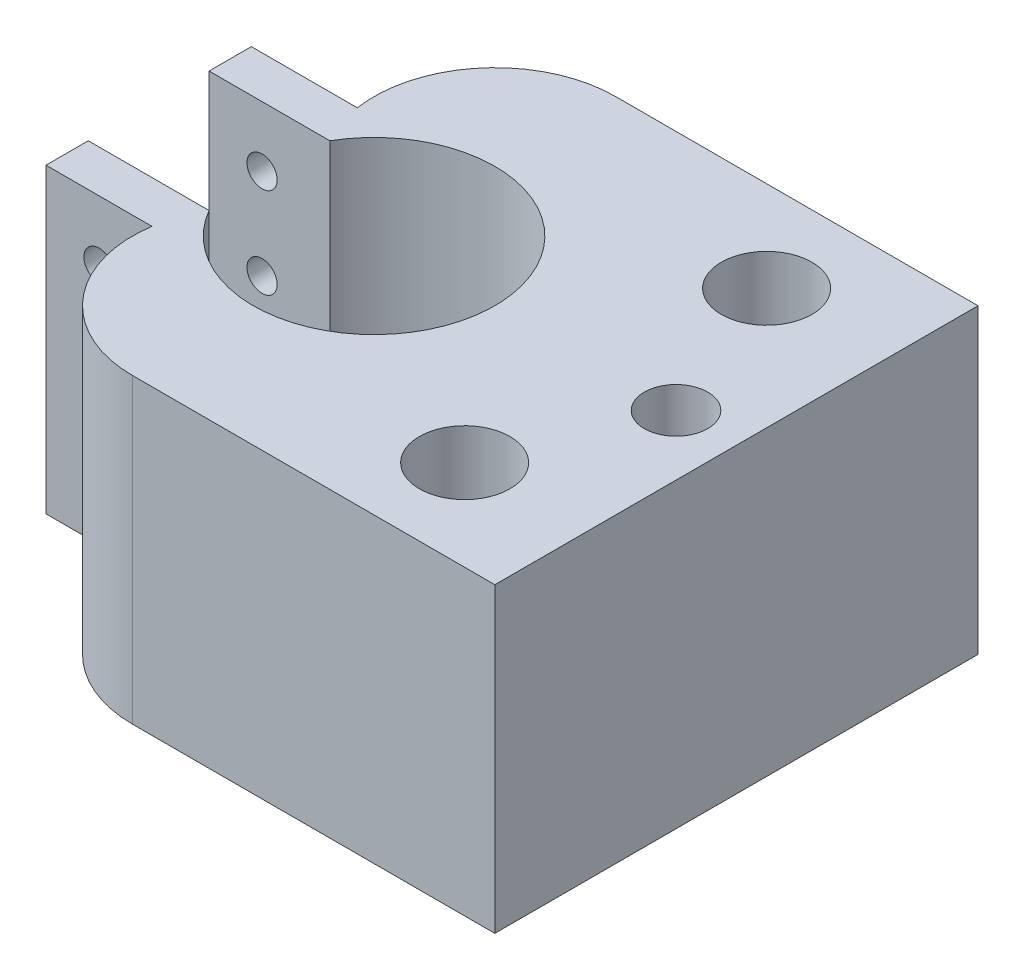
ISO-10303-21;
HEADER;
FILE_DESCRIPTION(('STEP AP214'),'2;1');
FILE_NAME('part.step','',(''),(''),'','','');
FILE_SCHEMA(('AUTOMOTIVE_DESIGN { 1 0 10303 214 1 1 1 1 }'));
ENDSEC;
DATA;
#1=APPLICATION_CONTEXT('core data for automotive mechanical design processes');
#2=APPLICATION_PROTOCOL_DEFINITION('international standard','automotive_design',2000,#1);
#3=PRODUCT_CONTEXT('',#1,'mechanical');
#4=PRODUCT('Part','Part','',(#3));
#5=PRODUCT_RELATED_PRODUCT_CATEGORY('part','',(#4));
#6=PRODUCT_DEFINITION_FORMATION('','',#4);
#7=PRODUCT_DEFINITION_CONTEXT('part definition',#1,'design');
#8=PRODUCT_DEFINITION('design','',#6,#7);
#9=PRODUCT_DEFINITION_SHAPE('','',#8);
#10=(LENGTH_UNIT() NAMED_UNIT(*) SI_UNIT(.MILLI.,.METRE.));
#11=(NAMED_UNIT(*) PLANE_ANGLE_UNIT() SI_UNIT($,.RADIAN.));
#12=(NAMED_UNIT(*) SI_UNIT($,.STERADIAN.) SOLID_ANGLE_UNIT());
#13=UNCERTAINTY_MEASURE_WITH_UNIT(LENGTH_MEASURE(1.E-05),#10,'distance_accuracy_value','');
#14=(GEOMETRIC_REPRESENTATION_CONTEXT(3) GLOBAL_UNCERTAINTY_ASSIGNED_CONTEXT((#13)) GLOBAL_UNIT_ASSIGNED_CONTEXT((#10,
#11,#12)) REPRESENTATION_CONTEXT('',''));
#15=CARTESIAN_POINT('',(0.,0.,0.));
#16=DIRECTION('',(0.,0.,1.));
#17=DIRECTION('',(1.,0.,0.));
#18=AXIS2_PLACEMENT_3D('',#15,#16,#17);
#19=CARTESIAN_POINT('',(-20.,50.,19.1770717334674));
#20=DIRECTION('',(0.,1.,0.));
#21=DIRECTION('',(0.,0.,1.));
#22=AXIS2_PLACEMENT_3D('',#19,#20,#21);
#23=PLANE('',#22);
#24=CARTESIAN_POINT('',(19.9999999999999,50.,24.1770717334674));
#25=DIRECTION('',(0.,1.,0.));
#26=DIRECTION('',(0.,0.,-1.));
#27=AXIS2_PLACEMENT_3D('',#24,#25,#26);
#28=CIRCLE('',#27,7.5);
#29=CARTESIAN_POINT('',(19.9999999999999,50.,16.6770717334674));
#30=VERTEX_POINT('',#29);
#31=EDGE_CURVE('E326',#30,#30,#28,.T.);
#32=ORIENTED_EDGE('',*,*,#31,.F.);
#33=EDGE_LOOP('',(#32));
#34=FACE_BOUND('',#33,.T.);
#35=DIRECTION('',(0.,0.,-1.));
#36=VECTOR('',#35,1.);
#37=CARTESIAN_POINT('',(40.,50.,-40.8229282665326));
#38=LINE('',#37,#36);
#39=CARTESIAN_POINT('',(40.,50.,39.1770717334675));
#40=VERTEX_POINT('',#39);
#41=CARTESIAN_POINT('',(40.,50.,-40.8229282665326));
#42=VERTEX_POINT('',#41);
#43=EDGE_CURVE('E178',#40,#42,#38,.T.);
#44=ORIENTED_EDGE('',*,*,#43,.T.);
#45=DIRECTION('',(-1.,0.,0.));
#46=VECTOR('',#45,1.);
#47=CARTESIAN_POINT('',(-20.,50.,-40.8229282665326));
#48=LINE('',#47,#46);
#49=CARTESIAN_POINT('',(-20.,50.,-40.8229282665326));
#50=VERTEX_POINT('',#49);
#51=EDGE_CURVE('E106',#42,#50,#48,.T.);
#52=ORIENTED_EDGE('',*,*,#51,.T.);
#53=CARTESIAN_POINT('',(-20.,50.,-20.8229282665326));
#54=DIRECTION('',(0.,1.,0.));
#55=DIRECTION('',(0.,0.,1.));
#56=AXIS2_PLACEMENT_3D('',#53,#54,#55);
#57=CIRCLE('',#56,20.);
#58=CARTESIAN_POINT('',(-39.7737199332852,50.,-17.8229282665326));
#59=VERTEX_POINT('',#58);
#60=EDGE_CURVE('E205',#50,#59,#57,.T.);
#61=ORIENTED_EDGE('',*,*,#60,.T.);
#62=DIRECTION('',(-1.,0.,0.));
#63=VECTOR('',#62,1.);
#64=CARTESIAN_POINT('',(-57.3205080756888,50.,-17.8229282665326));
#65=LINE('',#64,#63);
#66=CARTESIAN_POINT('',(-57.3205080756888,50.,-17.8229282665326));
#67=VERTEX_POINT('',#66);
#68=EDGE_CURVE('E224',#59,#67,#65,.T.);
#69=ORIENTED_EDGE('',*,*,#68,.T.);
#70=DIRECTION('',(0.,0.,1.));
#71=VECTOR('',#70,1.);
#72=CARTESIAN_POINT('',(-57.3205080756888,50.,-17.8229282665326));
#73=LINE('',#72,#71);
#74=CARTESIAN_POINT('',(-57.3205080756888,50.,-10.8229282665326));
#75=VERTEX_POINT('',#74);
#76=EDGE_CURVE('E221',#67,#75,#73,.T.);
#77=ORIENTED_EDGE('',*,*,#76,.T.);
#78=DIRECTION('',(1.,0.,0.));
#79=VECTOR('',#78,1.);
#80=CARTESIAN_POINT('',(-57.3205080756888,50.,-10.8229282665326));
#81=LINE('',#80,#79);
#82=CARTESIAN_POINT('',(-37.3205080756888,50.,-10.8229282665326));
#83=VERTEX_POINT('',#82);
#84=EDGE_CURVE('E223',#75,#83,#81,.T.);
#85=ORIENTED_EDGE('',*,*,#84,.T.);
#86=CARTESIAN_POINT('',(-20.,50.,-0.822928266532567));
#87=DIRECTION('',(0.,-1.,0.));
#88=DIRECTION('',(0.,0.,1.));
#89=AXIS2_PLACEMENT_3D('',#86,#87,#88);
#90=CIRCLE('',#89,20.);
#91=CARTESIAN_POINT('',(-37.3205080756888,50.,9.17707173346743));
#92=VERTEX_POINT('',#91);
#93=EDGE_CURVE('E226',#83,#92,#90,.T.);
#94=ORIENTED_EDGE('',*,*,#93,.T.);
#95=DIRECTION('',(-1.,0.,0.));
#96=VECTOR('',#95,1.);
#97=CARTESIAN_POINT('',(-57.3205080756888,50.,9.17707173346739));
#98=LINE('',#97,#96);
#99=CARTESIAN_POINT('',(-57.3205080756888,50.,9.17707173346739));
#100=VERTEX_POINT('',#99);
#101=EDGE_CURVE('E232',#92,#100,#98,.T.);
#102=ORIENTED_EDGE('',*,*,#101,.T.);
#103=DIRECTION('',(0.,0.,1.));
#104=VECTOR('',#103,1.);
#105=CARTESIAN_POINT('',(-57.3205080756888,50.,16.1770717334674));
#106=LINE('',#105,#104);
#107=CARTESIAN_POINT('',(-57.3205080756888,50.,16.1770717334674));
#108=VERTEX_POINT('',#107);
#109=EDGE_CURVE('E137',#100,#108,#106,.T.);
#110=ORIENTED_EDGE('',*,*,#109,.T.);
#111=DIRECTION('',(1.,0.,0.));
#112=VECTOR('',#111,1.);
#113=CARTESIAN_POINT('',(-57.3205080756888,50.,16.1770717334674));
#114=LINE('',#113,#112);
#115=CARTESIAN_POINT('',(-39.7737199332852,50.,16.1770717334674));
#116=VERTEX_POINT('',#115);
#117=EDGE_CURVE('E131',#108,#116,#114,.T.);
#118=ORIENTED_EDGE('',*,*,#117,.T.);
#119=CARTESIAN_POINT('',(-20.,50.,19.1770717334674));
#120=DIRECTION('',(0.,1.,0.));
#121=DIRECTION('',(0.,0.,1.));
#122=AXIS2_PLACEMENT_3D('',#119,#120,#121);
#123=CIRCLE('',#122,20.);
#124=CARTESIAN_POINT('',(-20.,50.,39.1770717334675));
#125=VERTEX_POINT('',#124);
#126=EDGE_CURVE('E135',#116,#125,#123,.T.);
#127=ORIENTED_EDGE('',*,*,#126,.T.);
#128=DIRECTION('',(1.,0.,0.));
#129=VECTOR('',#128,1.);
#130=CARTESIAN_POINT('',(-20.,50.,39.1770717334675));
#131=LINE('',#130,#129);
#132=EDGE_CURVE('E51',#125,#40,#131,.T.);
#133=ORIENTED_EDGE('',*,*,#132,.T.);
#134=EDGE_LOOP('',(#44,#52,#61,#69,#77,#85,#94,#102,#110,#118,#127,#133));
#135=FACE_BOUND('',#134,.T.);
#136=CARTESIAN_POINT('',(20.,50.,-25.8229282665326));
#137=DIRECTION('',(0.,1.,0.));
#138=DIRECTION('',(0.,0.,1.));
#139=AXIS2_PLACEMENT_3D('',#136,#137,#138);
#140=CIRCLE('',#139,7.5);
#141=CARTESIAN_POINT('',(20.,50.,-18.3229282665326));
#142=VERTEX_POINT('',#141);
#143=EDGE_CURVE('E159',#142,#142,#140,.T.);
#144=ORIENTED_EDGE('',*,*,#143,.F.);
#145=EDGE_LOOP('',(#144));
#146=FACE_BOUND('',#145,.T.);
#147=CARTESIAN_POINT('',(30.,50.,-0.822928266532594));
#148=DIRECTION('',(0.,1.,0.));
#149=DIRECTION('',(0.,0.,1.));
#150=AXIS2_PLACEMENT_3D('',#147,#148,#149);
#151=CIRCLE('',#150,5.24999999999999);
#152=CARTESIAN_POINT('',(30.,50.,4.4270717334674));
#153=VERTEX_POINT('',#152);
#154=EDGE_CURVE('E320',#153,#153,#151,.T.);
#155=ORIENTED_EDGE('',*,*,#154,.F.);
#156=EDGE_LOOP('',(#155));
#157=FACE_BOUND('',#156,.T.);
#158=ADVANCED_FACE('F34',(#34,#135,#146,#157),#23,.T.);
#159=CARTESIAN_POINT('',(-20.,0.,19.1770717334674));
#160=DIRECTION('',(0.,1.,0.));
#161=DIRECTION('',(0.,0.,1.));
#162=AXIS2_PLACEMENT_3D('',#159,#160,#161);
#163=PLANE('',#162);
#164=DIRECTION('',(0.,0.,-1.));
#165=VECTOR('',#164,1.);
#166=CARTESIAN_POINT('',(40.,0.,-40.8229282665326));
#167=LINE('',#166,#165);
#168=CARTESIAN_POINT('',(40.,0.,39.1770717334675));
#169=VERTEX_POINT('',#168);
#170=CARTESIAN_POINT('',(40.,0.,-40.8229282665326));
#171=VERTEX_POINT('',#170);
#172=EDGE_CURVE('E155',#169,#171,#167,.T.);
#173=ORIENTED_EDGE('',*,*,#172,.F.);
#174=DIRECTION('',(1.,0.,0.));
#175=VECTOR('',#174,1.);
#176=CARTESIAN_POINT('',(-20.,0.,39.1770717334675));
#177=LINE('',#176,#175);
#178=CARTESIAN_POINT('',(-20.,0.,39.1770717334675));
#179=VERTEX_POINT('',#178);
#180=EDGE_CURVE('E98',#179,#169,#177,.T.);
#181=ORIENTED_EDGE('',*,*,#180,.F.);
#182=CARTESIAN_POINT('',(-20.,0.,19.1770717334674));
#183=DIRECTION('',(0.,1.,0.));
#184=DIRECTION('',(0.,0.,1.));
#185=AXIS2_PLACEMENT_3D('',#182,#183,#184);
#186=CIRCLE('',#185,20.);
#187=CARTESIAN_POINT('',(-39.7737199332852,0.,16.1770717334674));
#188=VERTEX_POINT('',#187);
#189=EDGE_CURVE('E92',#188,#179,#186,.T.);
#190=ORIENTED_EDGE('',*,*,#189,.F.);
#191=DIRECTION('',(1.,0.,0.));
#192=VECTOR('',#191,1.);
#193=CARTESIAN_POINT('',(-57.3205080756888,0.,16.1770717334674));
#194=LINE('',#193,#192);
#195=CARTESIAN_POINT('',(-57.3205080756888,0.,16.1770717334674));
#196=VERTEX_POINT('',#195);
#197=EDGE_CURVE('E145',#196,#188,#194,.T.);
#198=ORIENTED_EDGE('',*,*,#197,.F.);
#199=DIRECTION('',(0.,0.,1.));
#200=VECTOR('',#199,1.);
#201=CARTESIAN_POINT('',(-57.3205080756888,0.,16.1770717334674));
#202=LINE('',#201,#200);
#203=CARTESIAN_POINT('',(-57.3205080756888,0.,9.17707173346739));
#204=VERTEX_POINT('',#203);
#205=EDGE_CURVE('E173',#204,#196,#202,.T.);
#206=ORIENTED_EDGE('',*,*,#205,.F.);
#207=DIRECTION('',(-1.,0.,0.));
#208=VECTOR('',#207,1.);
#209=CARTESIAN_POINT('',(-57.3205080756888,0.,9.17707173346739));
#210=LINE('',#209,#208);
#211=CARTESIAN_POINT('',(-37.3205080756888,0.,9.17707173346743));
#212=VERTEX_POINT('',#211);
#213=EDGE_CURVE('E171',#212,#204,#210,.T.);
#214=ORIENTED_EDGE('',*,*,#213,.F.);
#215=CARTESIAN_POINT('',(-20.,0.,-0.822928266532567));
#216=DIRECTION('',(0.,-1.,0.));
#217=DIRECTION('',(0.,0.,1.));
#218=AXIS2_PLACEMENT_3D('',#215,#216,#217);
#219=CIRCLE('',#218,20.);
#220=CARTESIAN_POINT('',(-37.3205080756888,0.,-10.8229282665326));
#221=VERTEX_POINT('',#220);
#222=EDGE_CURVE('E169',#221,#212,#219,.T.);
#223=ORIENTED_EDGE('',*,*,#222,.F.);
#224=DIRECTION('',(1.,0.,0.));
#225=VECTOR('',#224,1.);
#226=CARTESIAN_POINT('',(-57.3205080756888,0.,-10.8229282665326));
#227=LINE('',#226,#225);
#228=CARTESIAN_POINT('',(-57.3205080756888,0.,-10.8229282665326));
#229=VERTEX_POINT('',#228);
#230=EDGE_CURVE('E167',#229,#221,#227,.T.);
#231=ORIENTED_EDGE('',*,*,#230,.F.);
#232=DIRECTION('',(0.,0.,1.));
#233=VECTOR('',#232,1.);
#234=CARTESIAN_POINT('',(-57.3205080756888,0.,-17.8229282665326));
#235=LINE('',#234,#233);
#236=CARTESIAN_POINT('',(-57.3205080756888,0.,-17.8229282665326));
#237=VERTEX_POINT('',#236);
#238=EDGE_CURVE('E165',#237,#229,#235,.T.);
#239=ORIENTED_EDGE('',*,*,#238,.F.);
#240=DIRECTION('',(-1.,0.,0.));
#241=VECTOR('',#240,1.);
#242=CARTESIAN_POINT('',(-57.3205080756888,0.,-17.8229282665326));
#243=LINE('',#242,#241);
#244=CARTESIAN_POINT('',(-39.7737199332852,0.,-17.8229282665326));
#245=VERTEX_POINT('',#244);
#246=EDGE_CURVE('E163',#245,#237,#243,.T.);
#247=ORIENTED_EDGE('',*,*,#246,.F.);
#248=CARTESIAN_POINT('',(-20.,0.,-20.8229282665326));
#249=DIRECTION('',(0.,1.,0.));
#250=DIRECTION('',(0.,0.,1.));
#251=AXIS2_PLACEMENT_3D('',#248,#249,#250);
#252=CIRCLE('',#251,20.);
#253=CARTESIAN_POINT('',(-20.,0.,-40.8229282665326));
#254=VERTEX_POINT('',#253);
#255=EDGE_CURVE('E161',#254,#245,#252,.T.);
#256=ORIENTED_EDGE('',*,*,#255,.F.);
#257=DIRECTION('',(-1.,0.,0.));
#258=VECTOR('',#257,1.);
#259=CARTESIAN_POINT('',(-20.,0.,-40.8229282665326));
#260=LINE('',#259,#258);
#261=EDGE_CURVE('E158',#171,#254,#260,.T.);
#262=ORIENTED_EDGE('',*,*,#261,.F.);
#263=EDGE_LOOP('',(#173,#181,#190,#198,#206,#214,#223,#231,#239,#247,#256,#262));
#264=FACE_BOUND('',#263,.T.);
#265=CARTESIAN_POINT('',(20.,0.,-25.8229282665326));
#266=DIRECTION('',(0.,1.,0.));
#267=DIRECTION('',(0.,0.,1.));
#268=AXIS2_PLACEMENT_3D('',#265,#266,#267);
#269=CIRCLE('',#268,7.5);
#270=CARTESIAN_POINT('',(20.,0.,-18.3229282665326));
#271=VERTEX_POINT('',#270);
#272=EDGE_CURVE('E329',#271,#271,#269,.T.);
#273=ORIENTED_EDGE('',*,*,#272,.T.);
#274=EDGE_LOOP('',(#273));
#275=FACE_BOUND('',#274,.T.);
#276=CARTESIAN_POINT('',(19.9999999999999,0.,24.1770717334674));
#277=DIRECTION('',(0.,1.,0.));
#278=DIRECTION('',(0.,0.,-1.));
#279=AXIS2_PLACEMENT_3D('',#276,#277,#278);
#280=CIRCLE('',#279,7.5);
#281=CARTESIAN_POINT('',(19.9999999999999,0.,16.6770717334674));
#282=VERTEX_POINT('',#281);
#283=EDGE_CURVE('E323',#282,#282,#280,.T.);
#284=ORIENTED_EDGE('',*,*,#283,.T.);
#285=EDGE_LOOP('',(#284));
#286=FACE_BOUND('',#285,.T.);
#287=CARTESIAN_POINT('',(30.,0.,-0.822928266532594));
#288=DIRECTION('',(0.,1.,0.));
#289=DIRECTION('',(0.,0.,1.));
#290=AXIS2_PLACEMENT_3D('',#287,#288,#289);
#291=CIRCLE('',#290,5.24999999999999);
#292=CARTESIAN_POINT('',(30.,0.,4.4270717334674));
#293=VERTEX_POINT('',#292);
#294=EDGE_CURVE('E319',#293,#293,#291,.T.);
#295=ORIENTED_EDGE('',*,*,#294,.T.);
#296=EDGE_LOOP('',(#295));
#297=FACE_BOUND('',#296,.T.);
#298=ADVANCED_FACE('F209',(#264,#275,#286,#297),#163,.F.);
#299=CARTESIAN_POINT('',(40.,50.,-40.8229282665326));
#300=DIRECTION('',(-1.,0.,0.));
#301=DIRECTION('',(0.,0.,1.));
#302=AXIS2_PLACEMENT_3D('',#299,#300,#301);
#303=PLANE('',#302);
#304=ORIENTED_EDGE('',*,*,#172,.T.);
#305=DIRECTION('',(0.,-1.,0.));
#306=VECTOR('',#305,1.);
#307=CARTESIAN_POINT('',(40.,50.,-40.8229282665326));
#308=LINE('',#307,#306);
#309=EDGE_CURVE('E11',#42,#171,#308,.T.);
#310=ORIENTED_EDGE('',*,*,#309,.F.);
#311=ORIENTED_EDGE('',*,*,#43,.F.);
#312=DIRECTION('',(0.,-1.,0.));
#313=VECTOR('',#312,1.);
#314=CARTESIAN_POINT('',(40.,50.,39.1770717334675));
#315=LINE('',#314,#313);
#316=EDGE_CURVE('E151',#40,#169,#315,.T.);
#317=ORIENTED_EDGE('',*,*,#316,.T.);
#318=EDGE_LOOP('',(#304,#310,#311,#317));
#319=FACE_BOUND('',#318,.T.);
#320=ADVANCED_FACE('F36',(#319),#303,.F.);
#321=CARTESIAN_POINT('',(-20.,50.,-40.8229282665326));
#322=DIRECTION('',(0.,0.,1.));
#323=DIRECTION('',(1.,0.,0.));
#324=AXIS2_PLACEMENT_3D('',#321,#322,#323);
#325=PLANE('',#324);
#326=ORIENTED_EDGE('',*,*,#261,.T.);
#327=DIRECTION('',(0.,-1.,0.));
#328=VECTOR('',#327,1.);
#329=CARTESIAN_POINT('',(-20.,50.,-40.8229282665326));
#330=LINE('',#329,#328);
#331=EDGE_CURVE('E43',#50,#254,#330,.T.);
#332=ORIENTED_EDGE('',*,*,#331,.F.);
#333=ORIENTED_EDGE('',*,*,#51,.F.);
#334=ORIENTED_EDGE('',*,*,#309,.T.);
#335=EDGE_LOOP('',(#326,#332,#333,#334));
#336=FACE_BOUND('',#335,.T.);
#337=ADVANCED_FACE('F394',(#336),#325,.F.);
#338=CARTESIAN_POINT('',(-20.,50.,-20.8229282665326));
#339=DIRECTION('',(0.,-1.,0.));
#340=DIRECTION('',(0.,0.,-1.));
#341=AXIS2_PLACEMENT_3D('',#338,#339,#340);
#342=CYLINDRICAL_SURFACE('',#341,20.);
#343=ORIENTED_EDGE('',*,*,#255,.T.);
#344=DIRECTION('',(0.,-1.,0.));
#345=VECTOR('',#344,1.);
#346=CARTESIAN_POINT('',(-39.7737199332852,50.,-17.8229282665326));
#347=LINE('',#346,#345);
#348=EDGE_CURVE('E197',#59,#245,#347,.T.);
#349=ORIENTED_EDGE('',*,*,#348,.F.);
#350=ORIENTED_EDGE('',*,*,#60,.F.);
#351=ORIENTED_EDGE('',*,*,#331,.T.);
#352=EDGE_LOOP('',(#343,#349,#350,#351));
#353=FACE_BOUND('',#352,.T.);
#354=ADVANCED_FACE('F203',(#353),#342,.T.);
#355=CARTESIAN_POINT('',(-57.3205080756888,50.,-17.8229282665326));
#356=DIRECTION('',(0.,0.,1.));
#357=DIRECTION('',(1.,0.,0.));
#358=AXIS2_PLACEMENT_3D('',#355,#356,#357);
#359=PLANE('',#358);
#360=CARTESIAN_POINT('',(-48.547114004487,40.,-17.8229282665326));
#361=DIRECTION('',(0.,0.,1.));
#362=DIRECTION('',(1.,0.,0.));
#363=AXIS2_PLACEMENT_3D('',#360,#361,#362);
#364=CIRCLE('',#363,2.5);
#365=CARTESIAN_POINT('',(-46.047114004487,40.,-17.8229282665326));
#366=VERTEX_POINT('',#365);
#367=EDGE_CURVE('E310',#366,#366,#364,.T.);
#368=ORIENTED_EDGE('',*,*,#367,.T.);
#369=EDGE_LOOP('',(#368));
#370=FACE_BOUND('',#369,.T.);
#371=CARTESIAN_POINT('',(-48.547114004487,25.,-17.8229282665326));
#372=DIRECTION('',(0.,0.,1.));
#373=DIRECTION('',(1.,0.,0.));
#374=AXIS2_PLACEMENT_3D('',#371,#372,#373);
#375=CIRCLE('',#374,2.5);
#376=CARTESIAN_POINT('',(-46.047114004487,25.,-17.8229282665326));
#377=VERTEX_POINT('',#376);
#378=EDGE_CURVE('E307',#377,#377,#375,.T.);
#379=ORIENTED_EDGE('',*,*,#378,.T.);
#380=EDGE_LOOP('',(#379));
#381=FACE_BOUND('',#380,.T.);
#382=CARTESIAN_POINT('',(-48.547114004487,10.,-17.8229282665326));
#383=DIRECTION('',(0.,0.,1.));
#384=DIRECTION('',(1.,0.,0.));
#385=AXIS2_PLACEMENT_3D('',#382,#383,#384);
#386=CIRCLE('',#385,2.5);
#387=CARTESIAN_POINT('',(-46.047114004487,10.,-17.8229282665326));
#388=VERTEX_POINT('',#387);
#389=EDGE_CURVE('E357',#388,#388,#386,.T.);
#390=ORIENTED_EDGE('',*,*,#389,.T.);
#391=EDGE_LOOP('',(#390));
#392=FACE_BOUND('',#391,.T.);
#393=ORIENTED_EDGE('',*,*,#246,.T.);
#394=DIRECTION('',(0.,-1.,0.));
#395=VECTOR('',#394,1.);
#396=CARTESIAN_POINT('',(-57.3205080756888,50.,-17.8229282665326));
#397=LINE('',#396,#395);
#398=EDGE_CURVE('E194',#67,#237,#397,.T.);
#399=ORIENTED_EDGE('',*,*,#398,.F.);
#400=ORIENTED_EDGE('',*,*,#68,.F.);
#401=ORIENTED_EDGE('',*,*,#348,.T.);
#402=EDGE_LOOP('',(#393,#399,#400,#401));
#403=FACE_BOUND('',#402,.T.);
#404=ADVANCED_FACE('F215',(#370,#381,#392,#403),#359,.F.);
#405=CARTESIAN_POINT('',(-57.3205080756888,50.,-17.8229282665326));
#406=DIRECTION('',(1.,0.,0.));
#407=DIRECTION('',(0.,0.,-1.));
#408=AXIS2_PLACEMENT_3D('',#405,#406,#407);
#409=PLANE('',#408);
#410=ORIENTED_EDGE('',*,*,#238,.T.);
#411=DIRECTION('',(0.,-1.,0.));
#412=VECTOR('',#411,1.);
#413=CARTESIAN_POINT('',(-57.3205080756888,50.,-10.8229282665326));
#414=LINE('',#413,#412);
#415=EDGE_CURVE('E191',#75,#229,#414,.T.);
#416=ORIENTED_EDGE('',*,*,#415,.F.);
#417=ORIENTED_EDGE('',*,*,#76,.F.);
#418=ORIENTED_EDGE('',*,*,#398,.T.);
#419=EDGE_LOOP('',(#410,#416,#417,#418));
#420=FACE_BOUND('',#419,.T.);
#421=ADVANCED_FACE('F219',(#420),#409,.F.);
#422=CARTESIAN_POINT('',(-57.3205080756888,50.,-10.8229282665326));
#423=DIRECTION('',(0.,0.,-1.));
#424=DIRECTION('',(-1.,0.,0.));
#425=AXIS2_PLACEMENT_3D('',#422,#423,#424);
#426=PLANE('',#425);
#427=CARTESIAN_POINT('',(-48.547114004487,40.,-10.8229282665326));
#428=DIRECTION('',(0.,0.,-1.));
#429=DIRECTION('',(-1.,0.,0.));
#430=AXIS2_PLACEMENT_3D('',#427,#428,#429);
#431=CIRCLE('',#430,2.5);
#432=CARTESIAN_POINT('',(-51.047114004487,40.,-10.8229282665326));
#433=VERTEX_POINT('',#432);
#434=EDGE_CURVE('E306',#433,#433,#431,.T.);
#435=ORIENTED_EDGE('',*,*,#434,.T.);
#436=EDGE_LOOP('',(#435));
#437=FACE_BOUND('',#436,.T.);
#438=CARTESIAN_POINT('',(-48.547114004487,25.,-10.8229282665326));
#439=DIRECTION('',(0.,0.,-1.));
#440=DIRECTION('',(-1.,0.,0.));
#441=AXIS2_PLACEMENT_3D('',#438,#439,#440);
#442=CIRCLE('',#441,2.5);
#443=CARTESIAN_POINT('',(-51.047114004487,25.,-10.8229282665326));
#444=VERTEX_POINT('',#443);
#445=EDGE_CURVE('E313',#444,#444,#442,.T.);
#446=ORIENTED_EDGE('',*,*,#445,.T.);
#447=EDGE_LOOP('',(#446));
#448=FACE_BOUND('',#447,.T.);
#449=CARTESIAN_POINT('',(-48.547114004487,10.,-10.8229282665326));
#450=DIRECTION('',(0.,0.,-1.));
#451=DIRECTION('',(-1.,0.,0.));
#452=AXIS2_PLACEMENT_3D('',#449,#450,#451);
#453=CIRCLE('',#452,2.5);
#454=CARTESIAN_POINT('',(-51.047114004487,10.,-10.8229282665326));
#455=VERTEX_POINT('',#454);
#456=EDGE_CURVE('E360',#455,#455,#453,.T.);
#457=ORIENTED_EDGE('',*,*,#456,.T.);
#458=EDGE_LOOP('',(#457));
#459=FACE_BOUND('',#458,.T.);
#460=ORIENTED_EDGE('',*,*,#230,.T.);
#461=DIRECTION('',(0.,-1.,0.));
#462=VECTOR('',#461,1.);
#463=CARTESIAN_POINT('',(-37.3205080756888,50.,-10.8229282665326));
#464=LINE('',#463,#462);
#465=EDGE_CURVE('E188',#83,#221,#464,.T.);
#466=ORIENTED_EDGE('',*,*,#465,.F.);
#467=ORIENTED_EDGE('',*,*,#84,.F.);
#468=ORIENTED_EDGE('',*,*,#415,.T.);
#469=EDGE_LOOP('',(#460,#466,#467,#468));
#470=FACE_BOUND('',#469,.T.);
#471=ADVANCED_FACE('F371',(#437,#448,#459,#470),#426,.F.);
#472=CARTESIAN_POINT('',(-20.,50.,-0.822928266532567));
#473=DIRECTION('',(0.,-1.,0.));
#474=DIRECTION('',(0.,0.,-1.));
#475=AXIS2_PLACEMENT_3D('',#472,#473,#474);
#476=CYLINDRICAL_SURFACE('',#475,20.);
#477=ORIENTED_EDGE('',*,*,#222,.T.);
#478=DIRECTION('',(0.,-1.,0.));
#479=VECTOR('',#478,1.);
#480=CARTESIAN_POINT('',(-37.3205080756888,50.,9.17707173346743));
#481=LINE('',#480,#479);
#482=EDGE_CURVE('E185',#92,#212,#481,.T.);
#483=ORIENTED_EDGE('',*,*,#482,.F.);
#484=ORIENTED_EDGE('',*,*,#93,.F.);
#485=ORIENTED_EDGE('',*,*,#465,.T.);
#486=EDGE_LOOP('',(#477,#483,#484,#485));
#487=FACE_BOUND('',#486,.T.);
#488=ADVANCED_FACE('F375',(#487),#476,.F.);
#489=CARTESIAN_POINT('',(-57.3205080756888,50.,9.17707173346739));
#490=DIRECTION('',(0.,0.,1.));
#491=DIRECTION('',(1.,0.,0.));
#492=AXIS2_PLACEMENT_3D('',#489,#490,#491);
#493=PLANE('',#492);
#494=CARTESIAN_POINT('',(-48.547114004487,40.,9.17707173346741));
#495=DIRECTION('',(0.,0.,1.));
#496=DIRECTION('',(1.,0.,0.));
#497=AXIS2_PLACEMENT_3D('',#494,#495,#496);
#498=CIRCLE('',#497,2.5);
#499=CARTESIAN_POINT('',(-46.047114004487,40.,9.17707173346742));
#500=VERTEX_POINT('',#499);
#501=EDGE_CURVE('E304',#500,#500,#498,.T.);
#502=ORIENTED_EDGE('',*,*,#501,.T.);
#503=EDGE_LOOP('',(#502));
#504=FACE_BOUND('',#503,.T.);
#505=CARTESIAN_POINT('',(-48.547114004487,25.,9.17707173346741));
#506=DIRECTION('',(0.,0.,1.));
#507=DIRECTION('',(1.,0.,0.));
#508=AXIS2_PLACEMENT_3D('',#505,#506,#507);
#509=CIRCLE('',#508,2.5);
#510=CARTESIAN_POINT('',(-46.047114004487,25.,9.17707173346742));
#511=VERTEX_POINT('',#510);
#512=EDGE_CURVE('E359',#511,#511,#509,.T.);
#513=ORIENTED_EDGE('',*,*,#512,.T.);
#514=EDGE_LOOP('',(#513));
#515=FACE_BOUND('',#514,.T.);
#516=CARTESIAN_POINT('',(-48.547114004487,10.,9.17707173346741));
#517=DIRECTION('',(0.,0.,1.));
#518=DIRECTION('',(1.,0.,0.));
#519=AXIS2_PLACEMENT_3D('',#516,#517,#518);
#520=CIRCLE('',#519,2.5);
#521=CARTESIAN_POINT('',(-46.047114004487,10.,9.17707173346742));
#522=VERTEX_POINT('',#521);
#523=EDGE_CURVE('E365',#522,#522,#520,.T.);
#524=ORIENTED_EDGE('',*,*,#523,.T.);
#525=EDGE_LOOP('',(#524));
#526=FACE_BOUND('',#525,.T.);
#527=ORIENTED_EDGE('',*,*,#213,.T.);
#528=DIRECTION('',(0.,-1.,0.));
#529=VECTOR('',#528,1.);
#530=CARTESIAN_POINT('',(-57.3205080756888,50.,9.17707173346739));
#531=LINE('',#530,#529);
#532=EDGE_CURVE('E182',#100,#204,#531,.T.);
#533=ORIENTED_EDGE('',*,*,#532,.F.);
#534=ORIENTED_EDGE('',*,*,#101,.F.);
#535=ORIENTED_EDGE('',*,*,#482,.T.);
#536=EDGE_LOOP('',(#527,#533,#534,#535));
#537=FACE_BOUND('',#536,.T.);
#538=ADVANCED_FACE('F238',(#504,#515,#526,#537),#493,.F.);
#539=CARTESIAN_POINT('',(-57.3205080756888,50.,16.1770717334674));
#540=DIRECTION('',(1.,0.,0.));
#541=DIRECTION('',(0.,0.,-1.));
#542=AXIS2_PLACEMENT_3D('',#539,#540,#541);
#543=PLANE('',#542);
#544=ORIENTED_EDGE('',*,*,#205,.T.);
#545=DIRECTION('',(0.,-1.,0.));
#546=VECTOR('',#545,1.);
#547=CARTESIAN_POINT('',(-57.3205080756888,50.,16.1770717334674));
#548=LINE('',#547,#546);
#549=EDGE_CURVE('E146',#108,#196,#548,.T.);
#550=ORIENTED_EDGE('',*,*,#549,.F.);
#551=ORIENTED_EDGE('',*,*,#109,.F.);
#552=ORIENTED_EDGE('',*,*,#532,.T.);
#553=EDGE_LOOP('',(#544,#550,#551,#552));
#554=FACE_BOUND('',#553,.T.);
#555=ADVANCED_FACE('F242',(#554),#543,.F.);
#556=CARTESIAN_POINT('',(-57.3205080756888,50.,16.1770717334674));
#557=DIRECTION('',(0.,0.,-1.));
#558=DIRECTION('',(-1.,0.,0.));
#559=AXIS2_PLACEMENT_3D('',#556,#557,#558);
#560=PLANE('',#559);
#561=CARTESIAN_POINT('',(-48.547114004487,40.,16.1770717334674));
#562=DIRECTION('',(0.,0.,1.));
#563=DIRECTION('',(1.,0.,0.));
#564=AXIS2_PLACEMENT_3D('',#561,#562,#563);
#565=CIRCLE('',#564,2.5);
#566=CARTESIAN_POINT('',(-46.047114004487,40.,16.1770717334674));
#567=VERTEX_POINT('',#566);
#568=EDGE_CURVE('E301',#567,#567,#565,.T.);
#569=ORIENTED_EDGE('',*,*,#568,.F.);
#570=EDGE_LOOP('',(#569));
#571=FACE_BOUND('',#570,.T.);
#572=CARTESIAN_POINT('',(-48.547114004487,25.,16.1770717334674));
#573=DIRECTION('',(0.,0.,1.));
#574=DIRECTION('',(1.,0.,0.));
#575=AXIS2_PLACEMENT_3D('',#572,#573,#574);
#576=CIRCLE('',#575,2.5);
#577=CARTESIAN_POINT('',(-46.047114004487,25.,16.1770717334674));
#578=VERTEX_POINT('',#577);
#579=EDGE_CURVE('E530',#578,#578,#576,.T.);
#580=ORIENTED_EDGE('',*,*,#579,.F.);
#581=EDGE_LOOP('',(#580));
#582=FACE_BOUND('',#581,.T.);
#583=CARTESIAN_POINT('',(-48.547114004487,10.,16.1770717334674));
#584=DIRECTION('',(0.,0.,1.));
#585=DIRECTION('',(1.,0.,0.));
#586=AXIS2_PLACEMENT_3D('',#583,#584,#585);
#587=CIRCLE('',#586,2.5);
#588=CARTESIAN_POINT('',(-46.047114004487,10.,16.1770717334674));
#589=VERTEX_POINT('',#588);
#590=EDGE_CURVE('E526',#589,#589,#587,.T.);
#591=ORIENTED_EDGE('',*,*,#590,.F.);
#592=EDGE_LOOP('',(#591));
#593=FACE_BOUND('',#592,.T.);
#594=ORIENTED_EDGE('',*,*,#197,.T.);
#595=DIRECTION('',(0.,-1.,0.));
#596=VECTOR('',#595,1.);
#597=CARTESIAN_POINT('',(-39.7737199332852,50.,16.1770717334674));
#598=LINE('',#597,#596);
#599=EDGE_CURVE('E142',#116,#188,#598,.T.);
#600=ORIENTED_EDGE('',*,*,#599,.F.);
#601=ORIENTED_EDGE('',*,*,#117,.F.);
#602=ORIENTED_EDGE('',*,*,#549,.T.);
#603=EDGE_LOOP('',(#594,#600,#601,#602));
#604=FACE_BOUND('',#603,.T.);
#605=ADVANCED_FACE('F143',(#571,#582,#593,#604),#560,.F.);
#606=CARTESIAN_POINT('',(-20.,50.,19.1770717334674));
#607=DIRECTION('',(0.,-1.,0.));
#608=DIRECTION('',(0.,0.,-1.));
#609=AXIS2_PLACEMENT_3D('',#606,#607,#608);
#610=CYLINDRICAL_SURFACE('',#609,20.);
#611=ORIENTED_EDGE('',*,*,#189,.T.);
#612=DIRECTION('',(0.,-1.,0.));
#613=VECTOR('',#612,1.);
#614=CARTESIAN_POINT('',(-20.,50.,39.1770717334675));
#615=LINE('',#614,#613);
#616=EDGE_CURVE('E147',#125,#179,#615,.T.);
#617=ORIENTED_EDGE('',*,*,#616,.F.);
#618=ORIENTED_EDGE('',*,*,#126,.F.);
#619=ORIENTED_EDGE('',*,*,#599,.T.);
#620=EDGE_LOOP('',(#611,#617,#618,#619));
#621=FACE_BOUND('',#620,.T.);
#622=ADVANCED_FACE('F149',(#621),#610,.T.);
#623=CARTESIAN_POINT('',(-20.,50.,39.1770717334675));
#624=DIRECTION('',(0.,0.,-1.));
#625=DIRECTION('',(-1.,0.,0.));
#626=AXIS2_PLACEMENT_3D('',#623,#624,#625);
#627=PLANE('',#626);
#628=ORIENTED_EDGE('',*,*,#180,.T.);
#629=ORIENTED_EDGE('',*,*,#316,.F.);
#630=ORIENTED_EDGE('',*,*,#132,.F.);
#631=ORIENTED_EDGE('',*,*,#616,.T.);
#632=EDGE_LOOP('',(#628,#629,#630,#631));
#633=FACE_BOUND('',#632,.T.);
#634=ADVANCED_FACE('F246',(#633),#627,.F.);
#635=CARTESIAN_POINT('',(20.,50.,-25.8229282665326));
#636=DIRECTION('',(0.,-1.,0.));
#637=DIRECTION('',(0.,0.,-1.));
#638=AXIS2_PLACEMENT_3D('',#635,#636,#637);
#639=CYLINDRICAL_SURFACE('',#638,7.5);
#640=ORIENTED_EDGE('',*,*,#143,.T.);
#641=EDGE_LOOP('',(#640));
#642=FACE_BOUND('',#641,.T.);
#643=ORIENTED_EDGE('',*,*,#272,.F.);
#644=EDGE_LOOP('',(#643));
#645=FACE_BOUND('',#644,.T.);
#646=ADVANCED_FACE('F248',(#642,#645),#639,.F.);
#647=CARTESIAN_POINT('',(19.9999999999999,50.,24.1770717334674));
#648=DIRECTION('',(0.,-1.,0.));
#649=DIRECTION('',(0.,0.,-1.));
#650=AXIS2_PLACEMENT_3D('',#647,#648,#649);
#651=CYLINDRICAL_SURFACE('',#650,7.5);
#652=ORIENTED_EDGE('',*,*,#31,.T.);
#653=EDGE_LOOP('',(#652));
#654=FACE_BOUND('',#653,.T.);
#655=ORIENTED_EDGE('',*,*,#283,.F.);
#656=EDGE_LOOP('',(#655));
#657=FACE_BOUND('',#656,.T.);
#658=ADVANCED_FACE('F254',(#654,#657),#651,.F.);
#659=CARTESIAN_POINT('',(30.,50.,-0.822928266532594));
#660=DIRECTION('',(0.,-1.,0.));
#661=DIRECTION('',(0.,0.,-1.));
#662=AXIS2_PLACEMENT_3D('',#659,#660,#661);
#663=CYLINDRICAL_SURFACE('',#662,5.24999999999999);
#664=ORIENTED_EDGE('',*,*,#154,.T.);
#665=EDGE_LOOP('',(#664));
#666=FACE_BOUND('',#665,.T.);
#667=ORIENTED_EDGE('',*,*,#294,.F.);
#668=EDGE_LOOP('',(#667));
#669=FACE_BOUND('',#668,.T.);
#670=ADVANCED_FACE('F269',(#666,#669),#663,.F.);
#671=CARTESIAN_POINT('',(-48.547114004487,10.,-33.8229282665326));
#672=DIRECTION('',(0.,0.,1.));
#673=DIRECTION('',(1.,0.,0.));
#674=AXIS2_PLACEMENT_3D('',#671,#672,#673);
#675=CYLINDRICAL_SURFACE('',#674,2.5);
#676=ORIENTED_EDGE('',*,*,#590,.T.);
#677=EDGE_LOOP('',(#676));
#678=FACE_BOUND('',#677,.T.);
#679=ORIENTED_EDGE('',*,*,#523,.F.);
#680=EDGE_LOOP('',(#679));
#681=FACE_BOUND('',#680,.T.);
#682=ADVANCED_FACE('F273',(#678,#681),#675,.F.);
#683=CARTESIAN_POINT('',(-48.547114004487,25.,-33.8229282665326));
#684=DIRECTION('',(0.,0.,1.));
#685=DIRECTION('',(1.,0.,0.));
#686=AXIS2_PLACEMENT_3D('',#683,#684,#685);
#687=CYLINDRICAL_SURFACE('',#686,2.5);
#688=ORIENTED_EDGE('',*,*,#579,.T.);
#689=EDGE_LOOP('',(#688));
#690=FACE_BOUND('',#689,.T.);
#691=ORIENTED_EDGE('',*,*,#512,.F.);
#692=EDGE_LOOP('',(#691));
#693=FACE_BOUND('',#692,.T.);
#694=ADVANCED_FACE('F285',(#690,#693),#687,.F.);
#695=CARTESIAN_POINT('',(-48.547114004487,40.,-33.8229282665326));
#696=DIRECTION('',(0.,0.,1.));
#697=DIRECTION('',(1.,0.,0.));
#698=AXIS2_PLACEMENT_3D('',#695,#696,#697);
#699=CYLINDRICAL_SURFACE('',#698,2.5);
#700=ORIENTED_EDGE('',*,*,#568,.T.);
#701=EDGE_LOOP('',(#700));
#702=FACE_BOUND('',#701,.T.);
#703=ORIENTED_EDGE('',*,*,#501,.F.);
#704=EDGE_LOOP('',(#703));
#705=FACE_BOUND('',#704,.T.);
#706=ADVANCED_FACE('F279',(#702,#705),#699,.F.);
#707=ORIENTED_EDGE('',*,*,#456,.F.);
#708=EDGE_LOOP('',(#707));
#709=FACE_BOUND('',#708,.T.);
#710=ORIENTED_EDGE('',*,*,#389,.F.);
#711=EDGE_LOOP('',(#710));
#712=FACE_BOUND('',#711,.T.);
#713=ADVANCED_FACE('F275',(#709,#712),#675,.F.);
#714=ORIENTED_EDGE('',*,*,#445,.F.);
#715=EDGE_LOOP('',(#714));
#716=FACE_BOUND('',#715,.T.);
#717=ORIENTED_EDGE('',*,*,#378,.F.);
#718=EDGE_LOOP('',(#717));
#719=FACE_BOUND('',#718,.T.);
#720=ADVANCED_FACE('F278',(#716,#719),#687,.F.);
#721=ORIENTED_EDGE('',*,*,#434,.F.);
#722=EDGE_LOOP('',(#721));
#723=FACE_BOUND('',#722,.T.);
#724=ORIENTED_EDGE('',*,*,#367,.F.);
#725=EDGE_LOOP('',(#724));
#726=FACE_BOUND('',#725,.T.);
#727=ADVANCED_FACE('F283',(#723,#726),#699,.F.);
#728=CLOSED_SHELL('',(#158,#298,#320,#337,#354,#404,#421,#471,#488,#538,#555,#605,#622,#634,
#646,#658,#670,#682,#694,#706,#713,#720,#727));
#729=MANIFOLD_SOLID_BREP('B2',#728);
#730=ADVANCED_BREP_SHAPE_REPRESENTATION('',(#18,#729),#14);
#731=SHAPE_DEFINITION_REPRESENTATION(#9,#730);
ENDSEC;
END-ISO-10303-21;
